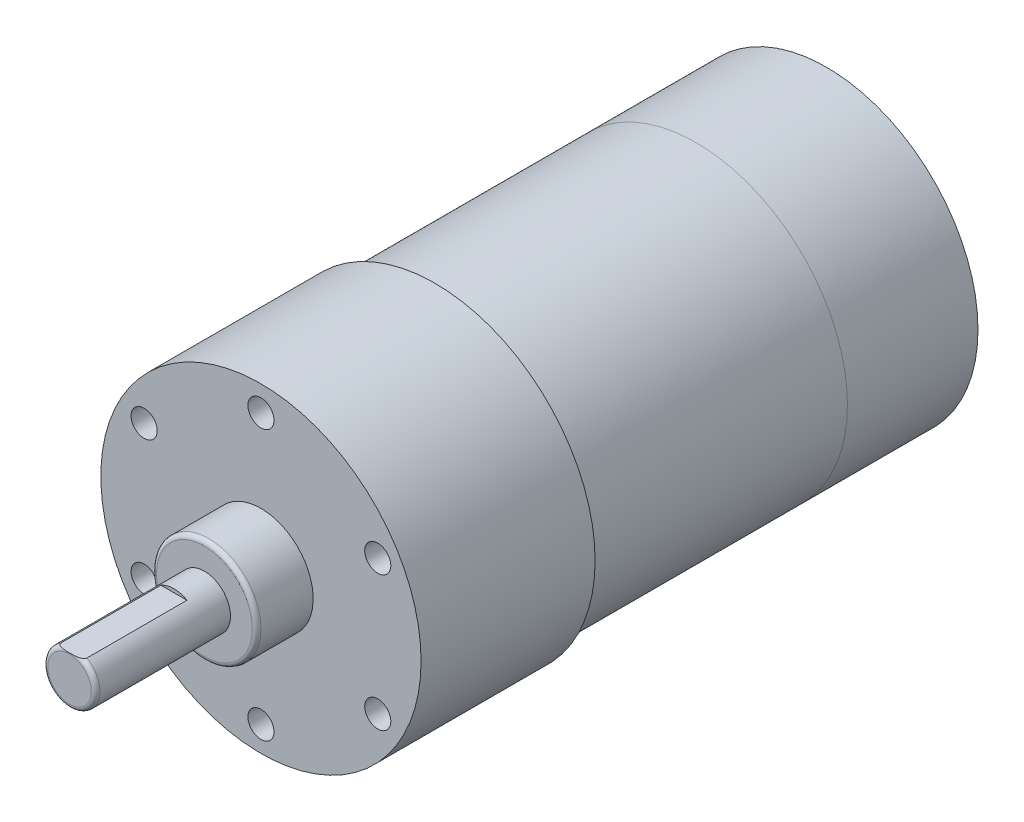
ISO-10303-21;
HEADER;
FILE_DESCRIPTION(('STEP AP214'),'2;1');
FILE_NAME('part.step','',(''),(''),'','','');
FILE_SCHEMA(('AUTOMOTIVE_DESIGN { 1 0 10303 214 1 1 1 1 }'));
ENDSEC;
DATA;
#1=APPLICATION_CONTEXT('core data for automotive mechanical design processes');
#2=APPLICATION_PROTOCOL_DEFINITION('international standard','automotive_design',2000,#1);
#3=PRODUCT_CONTEXT('',#1,'mechanical');
#4=PRODUCT('Part','Part','',(#3));
#5=PRODUCT_RELATED_PRODUCT_CATEGORY('part','',(#4));
#6=PRODUCT_DEFINITION_FORMATION('','',#4);
#7=PRODUCT_DEFINITION_CONTEXT('part definition',#1,'design');
#8=PRODUCT_DEFINITION('design','',#6,#7);
#9=PRODUCT_DEFINITION_SHAPE('','',#8);
#10=(LENGTH_UNIT() NAMED_UNIT(*) SI_UNIT(.MILLI.,.METRE.));
#11=(NAMED_UNIT(*) PLANE_ANGLE_UNIT() SI_UNIT($,.RADIAN.));
#12=(NAMED_UNIT(*) SI_UNIT($,.STERADIAN.) SOLID_ANGLE_UNIT());
#13=UNCERTAINTY_MEASURE_WITH_UNIT(LENGTH_MEASURE(1.E-05),#10,'distance_accuracy_value','');
#14=(GEOMETRIC_REPRESENTATION_CONTEXT(3) GLOBAL_UNCERTAINTY_ASSIGNED_CONTEXT((#13)) GLOBAL_UNIT_ASSIGNED_CONTEXT((#10,
#11,#12)) REPRESENTATION_CONTEXT('',''));
#15=CARTESIAN_POINT('',(0.,0.,0.));
#16=DIRECTION('',(0.,0.,1.));
#17=DIRECTION('',(1.,0.,0.));
#18=AXIS2_PLACEMENT_3D('',#15,#16,#17);
#19=CARTESIAN_POINT('',(0.,0.,-45.));
#20=DIRECTION('',(0.,0.,1.));
#21=DIRECTION('',(1.,0.,0.));
#22=AXIS2_PLACEMENT_3D('',#19,#20,#21);
#23=CYLINDRICAL_SURFACE('',#22,17.4);
#24=CARTESIAN_POINT('',(0.,0.,-45.));
#25=DIRECTION('',(0.,0.,-1.));
#26=DIRECTION('',(-1.,0.,0.));
#27=AXIS2_PLACEMENT_3D('',#24,#25,#26);
#28=CIRCLE('',#27,17.4);
#29=CARTESIAN_POINT('',(-17.4,0.,-45.));
#30=VERTEX_POINT('',#29);
#31=EDGE_CURVE('E11',#30,#30,#28,.T.);
#32=ORIENTED_EDGE('',*,*,#31,.F.);
#33=EDGE_LOOP('',(#32));
#34=FACE_BOUND('',#33,.T.);
#35=CARTESIAN_POINT('',(0.,0.,-30.));
#36=DIRECTION('',(0.,0.,-1.));
#37=DIRECTION('',(-1.,0.,0.));
#38=AXIS2_PLACEMENT_3D('',#35,#36,#37);
#39=CIRCLE('',#38,17.4);
#40=CARTESIAN_POINT('',(-17.4,0.,-30.));
#41=VERTEX_POINT('',#40);
#42=EDGE_CURVE('E46',#41,#41,#39,.T.);
#43=ORIENTED_EDGE('',*,*,#42,.T.);
#44=EDGE_LOOP('',(#43));
#45=FACE_BOUND('',#44,.T.);
#46=ADVANCED_FACE('F43',(#34,#45),#23,.T.);
#47=CARTESIAN_POINT('',(0.,0.,-45.));
#48=DIRECTION('',(0.,0.,-1.));
#49=DIRECTION('',(-1.,0.,0.));
#50=AXIS2_PLACEMENT_3D('',#47,#48,#49);
#51=PLANE('',#50);
#52=ORIENTED_EDGE('',*,*,#31,.T.);
#53=EDGE_LOOP('',(#52));
#54=FACE_BOUND('',#53,.T.);
#55=ADVANCED_FACE('F58',(#54),#51,.T.);
#56=CARTESIAN_POINT('',(0.,0.,-30.));
#57=DIRECTION('',(0.,0.,-1.));
#58=DIRECTION('',(-1.,0.,0.));
#59=AXIS2_PLACEMENT_3D('',#56,#57,#58);
#60=PLANE('',#59);
#61=ORIENTED_EDGE('',*,*,#42,.F.);
#62=EDGE_LOOP('',(#61));
#63=FACE_BOUND('',#62,.T.);
#64=ADVANCED_FACE('F56',(#63),#60,.F.);
#65=CLOSED_SHELL('',(#46,#55,#64));
#66=MANIFOLD_SOLID_BREP('B2',#65);
#67=CARTESIAN_POINT('',(0.,0.,26.5));
#68=DIRECTION('',(0.,0.,1.));
#69=DIRECTION('',(1.,0.,0.));
#70=AXIS2_PLACEMENT_3D('',#67,#68,#69);
#71=PLANE('',#70);
#72=CARTESIAN_POINT('',(0.,0.,26.5));
#73=DIRECTION('',(0.,0.,1.));
#74=DIRECTION('',(1.,0.,0.));
#75=AXIS2_PLACEMENT_3D('',#72,#73,#74);
#76=CIRCLE('',#75,5.5);
#77=CARTESIAN_POINT('',(5.5,0.,26.5));
#78=VERTEX_POINT('',#77);
#79=EDGE_CURVE('E207',#78,#78,#76,.T.);
#80=ORIENTED_EDGE('',*,*,#79,.T.);
#81=EDGE_LOOP('',(#80));
#82=FACE_BOUND('',#81,.T.);
#83=CARTESIAN_POINT('',(0.,0.,26.5));
#84=DIRECTION('',(0.,0.,1.));
#85=DIRECTION('',(1.,0.,0.));
#86=AXIS2_PLACEMENT_3D('',#83,#84,#85);
#87=CIRCLE('',#86,3.);
#88=CARTESIAN_POINT('',(3.,0.,26.5));
#89=VERTEX_POINT('',#88);
#90=EDGE_CURVE('E188',#89,#89,#87,.T.);
#91=ORIENTED_EDGE('',*,*,#90,.F.);
#92=EDGE_LOOP('',(#91));
#93=FACE_BOUND('',#92,.T.);
#94=ADVANCED_FACE('F84',(#82,#93),#71,.T.);
#95=CARTESIAN_POINT('',(0.,0.,20.));
#96=DIRECTION('',(0.,0.,1.));
#97=DIRECTION('',(1.,0.,0.));
#98=AXIS2_PLACEMENT_3D('',#95,#96,#97);
#99=PLANE('',#98);
#100=CARTESIAN_POINT('',(-13.4233937586588,7.75,20.));
#101=DIRECTION('',(0.,0.,1.));
#102=DIRECTION('',(1.,0.,0.));
#103=AXIS2_PLACEMENT_3D('',#100,#101,#102);
#104=CIRCLE('',#103,1.5);
#105=CARTESIAN_POINT('',(-11.9233937586588,7.75,20.));
#106=VERTEX_POINT('',#105);
#107=EDGE_CURVE('E146',#106,#106,#104,.T.);
#108=ORIENTED_EDGE('',*,*,#107,.F.);
#109=EDGE_LOOP('',(#108));
#110=FACE_BOUND('',#109,.T.);
#111=CARTESIAN_POINT('',(-13.4233937586588,-7.75,20.));
#112=DIRECTION('',(0.,0.,1.));
#113=DIRECTION('',(1.,0.,0.));
#114=AXIS2_PLACEMENT_3D('',#111,#112,#113);
#115=CIRCLE('',#114,1.5);
#116=CARTESIAN_POINT('',(-11.9233937586588,-7.75,20.));
#117=VERTEX_POINT('',#116);
#118=EDGE_CURVE('E145',#117,#117,#115,.T.);
#119=ORIENTED_EDGE('',*,*,#118,.F.);
#120=EDGE_LOOP('',(#119));
#121=FACE_BOUND('',#120,.T.);
#122=CARTESIAN_POINT('',(0.,-15.5,20.));
#123=DIRECTION('',(0.,0.,1.));
#124=DIRECTION('',(1.,0.,0.));
#125=AXIS2_PLACEMENT_3D('',#122,#123,#124);
#126=CIRCLE('',#125,1.5);
#127=CARTESIAN_POINT('',(1.5,-15.5,20.));
#128=VERTEX_POINT('',#127);
#129=EDGE_CURVE('E156',#128,#128,#126,.T.);
#130=ORIENTED_EDGE('',*,*,#129,.F.);
#131=EDGE_LOOP('',(#130));
#132=FACE_BOUND('',#131,.T.);
#133=CARTESIAN_POINT('',(13.4233937586588,7.75,20.));
#134=DIRECTION('',(0.,0.,1.));
#135=DIRECTION('',(1.,0.,0.));
#136=AXIS2_PLACEMENT_3D('',#133,#134,#135);
#137=CIRCLE('',#136,1.5);
#138=CARTESIAN_POINT('',(14.9233937586588,7.75,20.));
#139=VERTEX_POINT('',#138);
#140=EDGE_CURVE('E162',#139,#139,#137,.T.);
#141=ORIENTED_EDGE('',*,*,#140,.F.);
#142=EDGE_LOOP('',(#141));
#143=FACE_BOUND('',#142,.T.);
#144=CARTESIAN_POINT('',(0.,15.5,20.));
#145=DIRECTION('',(0.,0.,1.));
#146=DIRECTION('',(1.,0.,0.));
#147=AXIS2_PLACEMENT_3D('',#144,#145,#146);
#148=CIRCLE('',#147,1.5);
#149=CARTESIAN_POINT('',(1.5,15.5,20.));
#150=VERTEX_POINT('',#149);
#151=EDGE_CURVE('E168',#150,#150,#148,.T.);
#152=ORIENTED_EDGE('',*,*,#151,.F.);
#153=EDGE_LOOP('',(#152));
#154=FACE_BOUND('',#153,.T.);
#155=CARTESIAN_POINT('',(13.4233937586588,-7.75,20.));
#156=DIRECTION('',(0.,0.,1.));
#157=DIRECTION('',(1.,0.,0.));
#158=AXIS2_PLACEMENT_3D('',#155,#156,#157);
#159=CIRCLE('',#158,1.5);
#160=CARTESIAN_POINT('',(14.9233937586588,-7.75,20.));
#161=VERTEX_POINT('',#160);
#162=EDGE_CURVE('E174',#161,#161,#159,.T.);
#163=ORIENTED_EDGE('',*,*,#162,.F.);
#164=EDGE_LOOP('',(#163));
#165=FACE_BOUND('',#164,.T.);
#166=CARTESIAN_POINT('',(0.,0.,20.));
#167=DIRECTION('',(0.,0.,1.));
#168=DIRECTION('',(1.,0.,0.));
#169=AXIS2_PLACEMENT_3D('',#166,#167,#168);
#170=CIRCLE('',#169,18.4);
#171=CARTESIAN_POINT('',(18.4,0.,20.));
#172=VERTEX_POINT('',#171);
#173=EDGE_CURVE('E199',#172,#172,#170,.T.);
#174=ORIENTED_EDGE('',*,*,#173,.T.);
#175=EDGE_LOOP('',(#174));
#176=FACE_BOUND('',#175,.T.);
#177=CARTESIAN_POINT('',(0.,0.,20.));
#178=DIRECTION('',(0.,0.,1.));
#179=DIRECTION('',(1.,0.,0.));
#180=AXIS2_PLACEMENT_3D('',#177,#178,#179);
#181=CIRCLE('',#180,6.);
#182=CARTESIAN_POINT('',(-6.,0.,20.));
#183=VERTEX_POINT('',#182);
#184=EDGE_CURVE('E192',#183,#183,#181,.T.);
#185=ORIENTED_EDGE('',*,*,#184,.F.);
#186=EDGE_LOOP('',(#185));
#187=FACE_BOUND('',#186,.T.);
#188=ADVANCED_FACE('F237',(#110,#121,#132,#143,#154,#165,#176,#187),#99,.T.);
#189=CARTESIAN_POINT('',(0.,0.,0.));
#190=DIRECTION('',(0.,0.,1.));
#191=DIRECTION('',(1.,0.,0.));
#192=AXIS2_PLACEMENT_3D('',#189,#190,#191);
#193=PLANE('',#192);
#194=CARTESIAN_POINT('',(0.,0.,0.));
#195=DIRECTION('',(0.,0.,1.));
#196=DIRECTION('',(1.,0.,0.));
#197=AXIS2_PLACEMENT_3D('',#194,#195,#196);
#198=CIRCLE('',#197,18.4);
#199=CARTESIAN_POINT('',(18.4,0.,0.));
#200=VERTEX_POINT('',#199);
#201=EDGE_CURVE('E198',#200,#200,#198,.T.);
#202=ORIENTED_EDGE('',*,*,#201,.F.);
#203=EDGE_LOOP('',(#202));
#204=FACE_BOUND('',#203,.T.);
#205=CARTESIAN_POINT('',(0.,0.,0.));
#206=DIRECTION('',(0.,0.,1.));
#207=DIRECTION('',(1.,0.,0.));
#208=AXIS2_PLACEMENT_3D('',#205,#206,#207);
#209=CIRCLE('',#208,17.4);
#210=CARTESIAN_POINT('',(17.4,0.,0.));
#211=VERTEX_POINT('',#210);
#212=EDGE_CURVE('E202',#211,#211,#209,.F.);
#213=ORIENTED_EDGE('',*,*,#212,.F.);
#214=EDGE_LOOP('',(#213));
#215=FACE_BOUND('',#214,.T.);
#216=ADVANCED_FACE('F243',(#204,#215),#193,.F.);
#217=CARTESIAN_POINT('',(0.,0.,20.));
#218=DIRECTION('',(0.,0.,-1.));
#219=DIRECTION('',(-1.,0.,0.));
#220=AXIS2_PLACEMENT_3D('',#217,#218,#219);
#221=CYLINDRICAL_SURFACE('',#220,18.4);
#222=ORIENTED_EDGE('',*,*,#173,.F.);
#223=EDGE_LOOP('',(#222));
#224=FACE_BOUND('',#223,.T.);
#225=ORIENTED_EDGE('',*,*,#201,.T.);
#226=EDGE_LOOP('',(#225));
#227=FACE_BOUND('',#226,.T.);
#228=ADVANCED_FACE('F261',(#224,#227),#221,.T.);
#229=CARTESIAN_POINT('',(0.,0.,-30.));
#230=DIRECTION('',(0.,0.,1.));
#231=DIRECTION('',(1.,0.,0.));
#232=AXIS2_PLACEMENT_3D('',#229,#230,#231);
#233=CYLINDRICAL_SURFACE('',#232,17.4);
#234=CARTESIAN_POINT('',(0.,0.,-30.));
#235=DIRECTION('',(0.,0.,-1.));
#236=DIRECTION('',(-1.,0.,0.));
#237=AXIS2_PLACEMENT_3D('',#234,#235,#236);
#238=CIRCLE('',#237,17.4);
#239=CARTESIAN_POINT('',(-17.4,0.,-30.));
#240=VERTEX_POINT('',#239);
#241=EDGE_CURVE('E195',#240,#240,#238,.T.);
#242=ORIENTED_EDGE('',*,*,#241,.F.);
#243=EDGE_LOOP('',(#242));
#244=FACE_BOUND('',#243,.T.);
#245=ORIENTED_EDGE('',*,*,#212,.T.);
#246=EDGE_LOOP('',(#245));
#247=FACE_BOUND('',#246,.T.);
#248=ADVANCED_FACE('F258',(#244,#247),#233,.T.);
#249=CARTESIAN_POINT('',(0.,0.,-30.));
#250=DIRECTION('',(0.,0.,-1.));
#251=DIRECTION('',(-1.,0.,0.));
#252=AXIS2_PLACEMENT_3D('',#249,#250,#251);
#253=PLANE('',#252);
#254=ORIENTED_EDGE('',*,*,#241,.T.);
#255=EDGE_LOOP('',(#254));
#256=FACE_BOUND('',#255,.T.);
#257=ADVANCED_FACE('F254',(#256),#253,.T.);
#258=CARTESIAN_POINT('',(0.,0.,26.5));
#259=DIRECTION('',(0.,0.,-1.));
#260=DIRECTION('',(-1.,0.,0.));
#261=AXIS2_PLACEMENT_3D('',#258,#259,#260);
#262=CYLINDRICAL_SURFACE('',#261,6.);
#263=CARTESIAN_POINT('',(0.,0.,26.));
#264=DIRECTION('',(0.,0.,1.));
#265=DIRECTION('',(1.,0.,0.));
#266=AXIS2_PLACEMENT_3D('',#263,#264,#265);
#267=CIRCLE('',#266,6.);
#268=CARTESIAN_POINT('',(-6.,0.,26.));
#269=VERTEX_POINT('',#268);
#270=EDGE_CURVE('E210',#269,#269,#267,.F.);
#271=CARTESIAN_POINT('',(-6.,0.,26.));
#272=CARTESIAN_POINT('',(-6.,0.,25.9375));
#273=CARTESIAN_POINT('',(-6.,0.,25.875));
#274=CARTESIAN_POINT('',(-6.,0.,25.75));
#275=CARTESIAN_POINT('',(-6.,0.,25.6875));
#276=CARTESIAN_POINT('',(-6.,0.,25.5625));
#277=CARTESIAN_POINT('',(-6.,0.,25.5));
#278=CARTESIAN_POINT('',(-6.,0.,25.375));
#279=CARTESIAN_POINT('',(-6.,0.,25.3125));
#280=CARTESIAN_POINT('',(-6.,0.,25.1875));
#281=CARTESIAN_POINT('',(-6.,0.,25.125));
#282=CARTESIAN_POINT('',(-6.,0.,25.));
#283=CARTESIAN_POINT('',(-6.,0.,24.9375));
#284=CARTESIAN_POINT('',(-6.,0.,24.8125));
#285=CARTESIAN_POINT('',(-6.,0.,24.75));
#286=CARTESIAN_POINT('',(-6.,0.,24.625));
#287=CARTESIAN_POINT('',(-6.,0.,24.5625));
#288=CARTESIAN_POINT('',(-6.,0.,24.4375));
#289=CARTESIAN_POINT('',(-6.,0.,24.375));
#290=CARTESIAN_POINT('',(-6.,0.,24.25));
#291=CARTESIAN_POINT('',(-6.,0.,24.1875));
#292=CARTESIAN_POINT('',(-6.,0.,24.0625));
#293=CARTESIAN_POINT('',(-6.,0.,24.));
#294=CARTESIAN_POINT('',(-6.,0.,23.875));
#295=CARTESIAN_POINT('',(-6.,0.,23.8125));
#296=CARTESIAN_POINT('',(-6.,0.,23.6875));
#297=CARTESIAN_POINT('',(-6.,0.,23.625));
#298=CARTESIAN_POINT('',(-6.,0.,23.5));
#299=CARTESIAN_POINT('',(-6.,0.,23.4375));
#300=CARTESIAN_POINT('',(-6.,0.,23.3125));
#301=CARTESIAN_POINT('',(-6.,0.,23.25));
#302=CARTESIAN_POINT('',(-6.,0.,23.125));
#303=CARTESIAN_POINT('',(-6.,0.,23.0625));
#304=CARTESIAN_POINT('',(-6.,0.,22.9375));
#305=CARTESIAN_POINT('',(-6.,0.,22.875));
#306=CARTESIAN_POINT('',(-6.,0.,22.75));
#307=CARTESIAN_POINT('',(-6.,0.,22.6875));
#308=CARTESIAN_POINT('',(-6.,0.,22.5625));
#309=CARTESIAN_POINT('',(-6.,0.,22.5));
#310=CARTESIAN_POINT('',(-6.,0.,22.375));
#311=CARTESIAN_POINT('',(-6.,0.,22.3125));
#312=CARTESIAN_POINT('',(-6.,0.,22.1875));
#313=CARTESIAN_POINT('',(-6.,0.,22.125));
#314=CARTESIAN_POINT('',(-6.,0.,22.));
#315=CARTESIAN_POINT('',(-6.,0.,21.9375));
#316=CARTESIAN_POINT('',(-6.,0.,21.8125));
#317=CARTESIAN_POINT('',(-6.,0.,21.75));
#318=CARTESIAN_POINT('',(-6.,0.,21.625));
#319=CARTESIAN_POINT('',(-6.,0.,21.5625));
#320=CARTESIAN_POINT('',(-6.,0.,21.4375));
#321=CARTESIAN_POINT('',(-6.,0.,21.375));
#322=CARTESIAN_POINT('',(-6.,0.,21.25));
#323=CARTESIAN_POINT('',(-6.,0.,21.1875));
#324=CARTESIAN_POINT('',(-6.,0.,21.0625));
#325=CARTESIAN_POINT('',(-6.,0.,21.));
#326=CARTESIAN_POINT('',(-6.,0.,20.875));
#327=CARTESIAN_POINT('',(-6.,0.,20.8125));
#328=CARTESIAN_POINT('',(-6.,0.,20.6875));
#329=CARTESIAN_POINT('',(-6.,0.,20.625));
#330=CARTESIAN_POINT('',(-6.,0.,20.5));
#331=CARTESIAN_POINT('',(-6.,0.,20.4375));
#332=CARTESIAN_POINT('',(-6.,0.,20.3125));
#333=CARTESIAN_POINT('',(-6.,0.,20.25));
#334=CARTESIAN_POINT('',(-6.,0.,20.125));
#335=CARTESIAN_POINT('',(-6.,0.,20.0625));
#336=CARTESIAN_POINT('',(-6.,0.,20.));
#337=B_SPLINE_CURVE_WITH_KNOTS('',3,(#271,#272,#273,#274,#275,#276,#277,#278,#279,#280,#281,
#282,#283,#284,#285,#286,#287,#288,#289,#290,#291,#292,#293,#294,#295,#296,#297,#298,#299,#300,
#301,#302,#303,#304,#305,#306,#307,#308,#309,#310,#311,#312,#313,#314,#315,#316,#317,#318,#319,
#320,#321,#322,#323,#324,#325,#326,#327,#328,#329,#330,#331,#332,#333,#334,#335,#336),
.UNSPECIFIED.,.F.,.F.,(4,2,2,2,2,2,2,2,2,2,2,2,2,2,2,2,2,2,2,2,2,2,2,2,2,2,2,2,2,2,2,2,4),(0.,
0.1875,0.375,0.5625,0.750000000000001,0.937500000000001,1.125,1.3125,1.5,1.6875,1.875,2.0625,
2.25,2.4375,2.625,2.8125,3.,3.1875,3.375,3.5625,3.75,3.9375,4.125,4.3125,4.5,4.6875,4.875,
5.0625,5.25,5.4375,5.625,5.8125,6.),.UNSPECIFIED.);
#338=EDGE_CURVE('BSEAM250',#269,#183,#337,.T.);
#339=ORIENTED_EDGE('',*,*,#270,.T.);
#340=ORIENTED_EDGE('',*,*,#184,.T.);
#341=ORIENTED_EDGE('',*,*,#338,.T.);
#342=ORIENTED_EDGE('',*,*,#338,.F.);
#343=EDGE_LOOP('',(#339,#341,#340,#342));
#344=FACE_BOUND('',#343,.T.);
#345=ADVANCED_FACE('F250',(#344),#262,.T.);
#346=CARTESIAN_POINT('',(0.,0.,26.));
#347=DIRECTION('',(0.,0.,1.));
#348=DIRECTION('',(1.,0.,0.));
#349=AXIS2_PLACEMENT_3D('',#346,#347,#348);
#350=TOROIDAL_SURFACE('',#349,5.5,0.5);
#351=ORIENTED_EDGE('',*,*,#270,.F.);
#352=EDGE_LOOP('',(#351));
#353=FACE_BOUND('',#352,.T.);
#354=ORIENTED_EDGE('',*,*,#79,.F.);
#355=EDGE_LOOP('',(#354));
#356=FACE_BOUND('',#355,.T.);
#357=ADVANCED_FACE('F253',(#353,#356),#350,.T.);
#358=CARTESIAN_POINT('',(0.,0.,42.));
#359=DIRECTION('',(0.,0.,-1.));
#360=DIRECTION('',(-1.,0.,0.));
#361=AXIS2_PLACEMENT_3D('',#358,#359,#360);
#362=CYLINDRICAL_SURFACE('',#361,3.);
#363=DIRECTION('',(0.,0.,1.));
#364=VECTOR('',#363,1.);
#365=CARTESIAN_POINT('',(1.49666295470958,2.6,30.));
#366=LINE('',#365,#364);
#367=CARTESIAN_POINT('',(1.49666295470958,2.6,30.));
#368=VERTEX_POINT('',#367);
#369=CARTESIAN_POINT('',(1.49666295470958,2.6,41.4999999999998));
#370=VERTEX_POINT('',#369);
#371=EDGE_CURVE('E186',#368,#370,#366,.T.);
#372=ORIENTED_EDGE('',*,*,#371,.T.);
#373=CARTESIAN_POINT('',(0.,0.,41.5));
#374=DIRECTION('',(0.,0.,1.));
#375=DIRECTION('',(1.,0.,0.));
#376=AXIS2_PLACEMENT_3D('',#373,#374,#375);
#377=CIRCLE('',#376,3.);
#378=CARTESIAN_POINT('',(-1.49666295470958,2.6,41.5));
#379=VERTEX_POINT('',#378);
#380=EDGE_CURVE('E98',#370,#379,#377,.F.);
#381=ORIENTED_EDGE('',*,*,#380,.T.);
#382=DIRECTION('',(0.,0.,1.));
#383=VECTOR('',#382,1.);
#384=CARTESIAN_POINT('',(-1.49666295470958,2.6,30.));
#385=LINE('',#384,#383);
#386=CARTESIAN_POINT('',(-1.49666295470958,2.6,30.));
#387=VERTEX_POINT('',#386);
#388=EDGE_CURVE('E185',#387,#379,#385,.T.);
#389=ORIENTED_EDGE('',*,*,#388,.F.);
#390=CARTESIAN_POINT('',(0.,0.,30.));
#391=DIRECTION('',(0.,0.,1.));
#392=DIRECTION('',(1.,0.,0.));
#393=AXIS2_PLACEMENT_3D('',#390,#391,#392);
#394=CIRCLE('',#393,3.);
#395=EDGE_CURVE('E180',#368,#387,#394,.T.);
#396=ORIENTED_EDGE('',*,*,#395,.F.);
#397=EDGE_LOOP('',(#372,#381,#389,#396));
#398=FACE_BOUND('',#397,.T.);
#399=ORIENTED_EDGE('',*,*,#90,.T.);
#400=EDGE_LOOP('',(#399));
#401=FACE_BOUND('',#400,.T.);
#402=ADVANCED_FACE('F217',(#398,#401),#362,.T.);
#403=CARTESIAN_POINT('',(0.,0.,42.));
#404=DIRECTION('',(0.,0.,1.));
#405=DIRECTION('',(1.,0.,0.));
#406=AXIS2_PLACEMENT_3D('',#403,#404,#405);
#407=PLANE('',#406);
#408=CARTESIAN_POINT('',(0.,0.,42.));
#409=DIRECTION('',(0.,0.,1.));
#410=DIRECTION('',(1.,0.,0.));
#411=AXIS2_PLACEMENT_3D('',#408,#409,#410);
#412=CIRCLE('',#411,2.5);
#413=CARTESIAN_POINT('',(-1.24721912892465,2.16666666666667,42.));
#414=VERTEX_POINT('',#413);
#415=EDGE_CURVE('E103',#414,#414,#412,.T.);
#416=ORIENTED_EDGE('',*,*,#415,.T.);
#417=EDGE_LOOP('',(#416));
#418=FACE_BOUND('',#417,.T.);
#419=ADVANCED_FACE('F235',(#418),#407,.T.);
#420=CARTESIAN_POINT('',(-1.49666295470958,2.6,30.));
#421=DIRECTION('',(0.,-1.,0.));
#422=DIRECTION('',(0.,0.,-1.));
#423=AXIS2_PLACEMENT_3D('',#420,#421,#422);
#424=PLANE('',#423);
#425=ORIENTED_EDGE('',*,*,#388,.T.);
#426=CARTESIAN_POINT('',(-1.49666295470958,2.6,41.5));
#427=CARTESIAN_POINT('',(-1.49669702817725,2.6,41.5149051021484));
#428=CARTESIAN_POINT('',(-1.49532916324475,2.6,41.529774095933));
#429=CARTESIAN_POINT('',(-1.49008555059725,2.6,41.5589406315826));
#430=CARTESIAN_POINT('',(-1.48623084270994,2.6,41.5732419088318));
#431=CARTESIAN_POINT('',(-1.47631424041933,2.6,41.6009976942714));
#432=CARTESIAN_POINT('',(-1.47025833364427,2.6,41.6144543845247));
#433=CARTESIAN_POINT('',(-1.45631551957669,2.6,41.6404029162101));
#434=CARTESIAN_POINT('',(-1.44842462542037,2.6,41.6528925766694));
#435=CARTESIAN_POINT('',(-1.42570518024786,2.6,41.6844102631289));
#436=CARTESIAN_POINT('',(-1.40965256605042,2.6,41.7025553894644));
#437=CARTESIAN_POINT('',(-1.37493497617681,2.6,41.73613599544));
#438=CARTESIAN_POINT('',(-1.35626302749216,2.6,41.7515639860004));
#439=CARTESIAN_POINT('',(-1.303311046172,2.6,41.7901504925236));
#440=CARTESIAN_POINT('',(-1.2673704467773,2.6,41.8110092009974));
#441=CARTESIAN_POINT('',(-1.19295719544131,2.6,41.847388756016));
#442=CARTESIAN_POINT('',(-1.15447968566197,2.6,41.8628989852143));
#443=CARTESIAN_POINT('',(-1.05901836077041,2.6,41.8958138881155));
#444=CARTESIAN_POINT('',(-1.00130953423696,2.6,41.911073498837));
#445=CARTESIAN_POINT('',(-0.884661853079624,2.6,41.9360190476372));
#446=CARTESIAN_POINT('',(-0.825720319679469,2.6,41.9456911693697));
#447=CARTESIAN_POINT('',(-0.706961867611124,2.6,41.9612892459589));
#448=CARTESIAN_POINT('',(-0.647141725368451,2.6,41.9671894614307));
#449=CARTESIAN_POINT('',(-0.527387957226671,2.6,41.9764426430905));
#450=CARTESIAN_POINT('',(-0.467454524720628,2.6,41.9797983644472));
#451=CARTESIAN_POINT('',(-0.360303639693319,2.6,41.9843271761355));
#452=CARTESIAN_POINT('',(-0.313098201426873,2.6,41.9858130032282));
#453=CARTESIAN_POINT('',(-0.218669247129662,2.6,41.9880539304078));
#454=CARTESIAN_POINT('',(-0.171445730569167,2.6,41.9888090071301));
#455=CARTESIAN_POINT('',(-0.0769568934924944,2.6,41.9897577844721));
#456=CARTESIAN_POINT('',(-0.0296915690013754,2.6,41.9899510485086));
#457=CARTESIAN_POINT('',(0.0648383568274983,2.6,41.9898205958692));
#458=CARTESIAN_POINT('',(0.112102958166579,2.6,41.989496880295));
#459=CARTESIAN_POINT('',(0.206489004396231,2.6,41.9882580510872));
#460=CARTESIAN_POINT('',(0.253610470119574,2.6,41.9873446407243));
#461=CARTESIAN_POINT('',(0.347830700528196,2.6,41.9847313431131));
#462=CARTESIAN_POINT('',(0.394929466241519,2.6,41.9830314956638));
#463=CARTESIAN_POINT('',(0.489032205532437,2.6,41.9785275098704));
#464=CARTESIAN_POINT('',(0.536036226633943,2.6,41.9757244177043));
#465=CARTESIAN_POINT('',(0.629922549059666,2.6,41.9685656531621));
#466=CARTESIAN_POINT('',(0.676804874337732,2.6,41.9642103140601));
#467=CARTESIAN_POINT('',(0.76359650866924,2.6,41.9541263142836));
#468=CARTESIAN_POINT('',(0.803538333446084,2.6,41.9486855014514));
#469=CARTESIAN_POINT('',(0.883122010625979,2.6,41.9357295010266));
#470=CARTESIAN_POINT('',(0.922763646083339,2.6,41.9282129375471));
#471=CARTESIAN_POINT('',(1.00139823900068,2.6,41.910494115249));
#472=CARTESIAN_POINT('',(1.04039205130276,2.6,41.9002957543494));
#473=CARTESIAN_POINT('',(1.11727064150479,2.6,41.8763996298495));
#474=CARTESIAN_POINT('',(1.1551569510228,2.6,41.8627069813272));
#475=CARTESIAN_POINT('',(1.22944813861561,2.6,41.8305463184295));
#476=CARTESIAN_POINT('',(1.26582905492489,2.6,41.8120216232796));
#477=CARTESIAN_POINT('',(1.33470227153027,2.6,41.7688231560639));
#478=CARTESIAN_POINT('',(1.36722000464244,2.6,41.744193326085));
#479=CARTESIAN_POINT('',(1.40822324657555,2.6,41.7036284868606));
#480=CARTESIAN_POINT('',(1.41978987048696,2.6,41.690816953772));
#481=CARTESIAN_POINT('',(1.44109681949932,2.6,41.6637313181759));
#482=CARTESIAN_POINT('',(1.45083729481483,2.6,41.6494573361155));
#483=CARTESIAN_POINT('',(1.46801249183189,2.6,41.6193494890491));
#484=CARTESIAN_POINT('',(1.47542073208243,2.6,41.6035002223719));
#485=CARTESIAN_POINT('',(1.48713863782566,2.6,41.5706994380282));
#486=CARTESIAN_POINT('',(1.49145442932523,2.6,41.553750172498));
#487=CARTESIAN_POINT('',(1.49627778271818,2.6,41.5208985771865));
#488=CARTESIAN_POINT('',(1.49709738041115,2.6,41.5050421628976));
#489=CARTESIAN_POINT('',(1.49575949781529,2.6,41.473323459888));
#490=CARTESIAN_POINT('',(1.49357704682929,2.6,41.4574622324275));
#491=CARTESIAN_POINT('',(1.48987446930463,2.6,41.4419527308315));
#492=B_SPLINE_CURVE_WITH_KNOTS('',3,(#426,#427,#428,#429,#430,#431,#432,#433,#434,#435,#436,
#437,#438,#439,#440,#441,#442,#443,#444,#445,#446,#447,#448,#449,#450,#451,#452,#453,#454,#455,
#456,#457,#458,#459,#460,#461,#462,#463,#464,#465,#466,#467,#468,#469,#470,#471,#472,#473,#474,
#475,#476,#477,#478,#479,#480,#481,#482,#483,#484,#485,#486,#487,#488,#489,#490,#491),
.UNSPECIFIED.,.F.,.F.,(4,2,2,2,2,2,2,2,2,2,2,2,2,2,2,2,2,2,2,2,2,2,2,2,2,2,2,2,2,2,2,2,4),(0.,
0.044595272164786,0.0888181097439601,0.132921543203815,0.177121710256437,0.249382432511188,
0.321839307557631,0.44579791119591,0.57000118916151,0.748597910004915,0.927634382412785,
1.1078799085406,1.28792998569448,1.42960976431829,1.57129407275093,1.71308845429779,
1.85488253373345,1.99626887743125,2.13764806682503,2.27889351181035,2.42010864904588,
2.54100078056763,2.66197323714651,2.78277082621242,2.90339259122099,3.02549842069348,
3.14674968392238,3.19840665202863,3.25005936909162,3.30227902718043,3.354394952239,
3.40174717858884,3.44949566606297),.UNSPECIFIED.);
#493=EDGE_CURVE('E41',#379,#370,#492,.T.);
#494=ORIENTED_EDGE('',*,*,#493,.T.);
#495=ORIENTED_EDGE('',*,*,#371,.F.);
#496=DIRECTION('',(1.,0.,0.));
#497=VECTOR('',#496,1.);
#498=CARTESIAN_POINT('',(-1.49666295470958,2.6,30.));
#499=LINE('',#498,#497);
#500=EDGE_CURVE('E182',#387,#368,#499,.T.);
#501=ORIENTED_EDGE('',*,*,#500,.F.);
#502=EDGE_LOOP('',(#425,#494,#495,#501));
#503=FACE_BOUND('',#502,.T.);
#504=ADVANCED_FACE('F222',(#503),#424,.F.);
#505=CARTESIAN_POINT('',(0.,0.,30.));
#506=DIRECTION('',(0.,0.,1.));
#507=DIRECTION('',(1.,0.,0.));
#508=AXIS2_PLACEMENT_3D('',#505,#506,#507);
#509=PLANE('',#508);
#510=ORIENTED_EDGE('',*,*,#395,.T.);
#511=ORIENTED_EDGE('',*,*,#500,.T.);
#512=EDGE_LOOP('',(#510,#511));
#513=FACE_BOUND('',#512,.T.);
#514=ADVANCED_FACE('F224',(#513),#509,.T.);
#515=CARTESIAN_POINT('',(13.4233937586588,-7.75,17.));
#516=DIRECTION('',(0.,0.,1.));
#517=DIRECTION('',(1.,0.,0.));
#518=AXIS2_PLACEMENT_3D('',#515,#516,#517);
#519=CONICAL_SURFACE('',#518,1.5,1.02974425867665);
#520=CARTESIAN_POINT('',(13.4233937586588,-7.75,16.0987090714587));
#521=VERTEX_POINT('',#520);
#522=VERTEX_LOOP('',#521);
#523=FACE_BOUND('',#522,.T.);
#524=CARTESIAN_POINT('',(13.4233937586588,-7.75,17.));
#525=DIRECTION('',(0.,0.,1.));
#526=DIRECTION('',(1.,0.,0.));
#527=AXIS2_PLACEMENT_3D('',#524,#525,#526);
#528=CIRCLE('',#527,1.5);
#529=CARTESIAN_POINT('',(14.9233937586588,-7.75,17.));
#530=VERTEX_POINT('',#529);
#531=EDGE_CURVE('E177',#530,#530,#528,.T.);
#532=ORIENTED_EDGE('',*,*,#531,.T.);
#533=EDGE_LOOP('',(#532));
#534=FACE_BOUND('',#533,.T.);
#535=ADVANCED_FACE('F226',(#523,#534),#519,.F.);
#536=CARTESIAN_POINT('',(13.4233937586588,-7.75,20.));
#537=DIRECTION('',(0.,0.,1.));
#538=DIRECTION('',(1.,0.,0.));
#539=AXIS2_PLACEMENT_3D('',#536,#537,#538);
#540=CYLINDRICAL_SURFACE('',#539,1.5);
#541=ORIENTED_EDGE('',*,*,#531,.F.);
#542=EDGE_LOOP('',(#541));
#543=FACE_BOUND('',#542,.T.);
#544=ORIENTED_EDGE('',*,*,#162,.T.);
#545=EDGE_LOOP('',(#544));
#546=FACE_BOUND('',#545,.T.);
#547=ADVANCED_FACE('F232',(#543,#546),#540,.F.);
#548=CARTESIAN_POINT('',(0.,15.5,17.));
#549=DIRECTION('',(0.,0.,1.));
#550=DIRECTION('',(1.,0.,0.));
#551=AXIS2_PLACEMENT_3D('',#548,#549,#550);
#552=CONICAL_SURFACE('',#551,1.5,1.02974425867665);
#553=CARTESIAN_POINT('',(0.,15.5,16.0987090714587));
#554=VERTEX_POINT('',#553);
#555=VERTEX_LOOP('',#554);
#556=FACE_BOUND('',#555,.T.);
#557=CARTESIAN_POINT('',(0.,15.5,17.));
#558=DIRECTION('',(0.,0.,1.));
#559=DIRECTION('',(1.,0.,0.));
#560=AXIS2_PLACEMENT_3D('',#557,#558,#559);
#561=CIRCLE('',#560,1.5);
#562=CARTESIAN_POINT('',(1.5,15.5,17.));
#563=VERTEX_POINT('',#562);
#564=EDGE_CURVE('E171',#563,#563,#561,.T.);
#565=ORIENTED_EDGE('',*,*,#564,.T.);
#566=EDGE_LOOP('',(#565));
#567=FACE_BOUND('',#566,.T.);
#568=ADVANCED_FACE('F365',(#556,#567),#552,.F.);
#569=CARTESIAN_POINT('',(0.,15.5,20.));
#570=DIRECTION('',(0.,0.,1.));
#571=DIRECTION('',(1.,0.,0.));
#572=AXIS2_PLACEMENT_3D('',#569,#570,#571);
#573=CYLINDRICAL_SURFACE('',#572,1.5);
#574=ORIENTED_EDGE('',*,*,#564,.F.);
#575=EDGE_LOOP('',(#574));
#576=FACE_BOUND('',#575,.T.);
#577=ORIENTED_EDGE('',*,*,#151,.T.);
#578=EDGE_LOOP('',(#577));
#579=FACE_BOUND('',#578,.T.);
#580=ADVANCED_FACE('F357',(#576,#579),#573,.F.);
#581=CARTESIAN_POINT('',(13.4233937586588,7.75,17.));
#582=DIRECTION('',(0.,0.,1.));
#583=DIRECTION('',(1.,0.,0.));
#584=AXIS2_PLACEMENT_3D('',#581,#582,#583);
#585=CONICAL_SURFACE('',#584,1.5,1.02974425867665);
#586=CARTESIAN_POINT('',(13.4233937586588,7.75,16.0987090714587));
#587=VERTEX_POINT('',#586);
#588=VERTEX_LOOP('',#587);
#589=FACE_BOUND('',#588,.T.);
#590=CARTESIAN_POINT('',(13.4233937586588,7.75,17.));
#591=DIRECTION('',(0.,0.,1.));
#592=DIRECTION('',(1.,0.,0.));
#593=AXIS2_PLACEMENT_3D('',#590,#591,#592);
#594=CIRCLE('',#593,1.5);
#595=CARTESIAN_POINT('',(14.9233937586588,7.75,17.));
#596=VERTEX_POINT('',#595);
#597=EDGE_CURVE('E165',#596,#596,#594,.T.);
#598=ORIENTED_EDGE('',*,*,#597,.T.);
#599=EDGE_LOOP('',(#598));
#600=FACE_BOUND('',#599,.T.);
#601=ADVANCED_FACE('F349',(#589,#600),#585,.F.);
#602=CARTESIAN_POINT('',(13.4233937586588,7.75,20.));
#603=DIRECTION('',(0.,0.,1.));
#604=DIRECTION('',(1.,0.,0.));
#605=AXIS2_PLACEMENT_3D('',#602,#603,#604);
#606=CYLINDRICAL_SURFACE('',#605,1.5);
#607=ORIENTED_EDGE('',*,*,#597,.F.);
#608=EDGE_LOOP('',(#607));
#609=FACE_BOUND('',#608,.T.);
#610=ORIENTED_EDGE('',*,*,#140,.T.);
#611=EDGE_LOOP('',(#610));
#612=FACE_BOUND('',#611,.T.);
#613=ADVANCED_FACE('F341',(#609,#612),#606,.F.);
#614=CARTESIAN_POINT('',(0.,-15.5,17.));
#615=DIRECTION('',(0.,0.,1.));
#616=DIRECTION('',(1.,0.,0.));
#617=AXIS2_PLACEMENT_3D('',#614,#615,#616);
#618=CONICAL_SURFACE('',#617,1.5,1.02974425867665);
#619=CARTESIAN_POINT('',(0.,-15.5,16.0987090714587));
#620=VERTEX_POINT('',#619);
#621=VERTEX_LOOP('',#620);
#622=FACE_BOUND('',#621,.T.);
#623=CARTESIAN_POINT('',(0.,-15.5,17.));
#624=DIRECTION('',(0.,0.,1.));
#625=DIRECTION('',(1.,0.,0.));
#626=AXIS2_PLACEMENT_3D('',#623,#624,#625);
#627=CIRCLE('',#626,1.5);
#628=CARTESIAN_POINT('',(1.5,-15.5,17.));
#629=VERTEX_POINT('',#628);
#630=EDGE_CURVE('E159',#629,#629,#627,.T.);
#631=ORIENTED_EDGE('',*,*,#630,.T.);
#632=EDGE_LOOP('',(#631));
#633=FACE_BOUND('',#632,.T.);
#634=ADVANCED_FACE('F333',(#622,#633),#618,.F.);
#635=CARTESIAN_POINT('',(0.,-15.5,20.));
#636=DIRECTION('',(0.,0.,1.));
#637=DIRECTION('',(1.,0.,0.));
#638=AXIS2_PLACEMENT_3D('',#635,#636,#637);
#639=CYLINDRICAL_SURFACE('',#638,1.5);
#640=ORIENTED_EDGE('',*,*,#630,.F.);
#641=EDGE_LOOP('',(#640));
#642=FACE_BOUND('',#641,.T.);
#643=ORIENTED_EDGE('',*,*,#129,.T.);
#644=EDGE_LOOP('',(#643));
#645=FACE_BOUND('',#644,.T.);
#646=ADVANCED_FACE('F325',(#642,#645),#639,.F.);
#647=CARTESIAN_POINT('',(-13.4233937586588,-7.75,17.));
#648=DIRECTION('',(0.,0.,1.));
#649=DIRECTION('',(1.,0.,0.));
#650=AXIS2_PLACEMENT_3D('',#647,#648,#649);
#651=CONICAL_SURFACE('',#650,1.5,1.02974425867665);
#652=CARTESIAN_POINT('',(-13.4233937586588,-7.75,16.0987090714587));
#653=VERTEX_POINT('',#652);
#654=VERTEX_LOOP('',#653);
#655=FACE_BOUND('',#654,.T.);
#656=CARTESIAN_POINT('',(-13.4233937586588,-7.75,17.));
#657=DIRECTION('',(0.,0.,1.));
#658=DIRECTION('',(1.,0.,0.));
#659=AXIS2_PLACEMENT_3D('',#656,#657,#658);
#660=CIRCLE('',#659,1.5);
#661=CARTESIAN_POINT('',(-11.9233937586588,-7.75,17.));
#662=VERTEX_POINT('',#661);
#663=EDGE_CURVE('E149',#662,#662,#660,.T.);
#664=ORIENTED_EDGE('',*,*,#663,.T.);
#665=EDGE_LOOP('',(#664));
#666=FACE_BOUND('',#665,.T.);
#667=ADVANCED_FACE('F317',(#655,#666),#651,.F.);
#668=CARTESIAN_POINT('',(-13.4233937586588,-7.75,20.));
#669=DIRECTION('',(0.,0.,1.));
#670=DIRECTION('',(1.,0.,0.));
#671=AXIS2_PLACEMENT_3D('',#668,#669,#670);
#672=CYLINDRICAL_SURFACE('',#671,1.5);
#673=ORIENTED_EDGE('',*,*,#663,.F.);
#674=EDGE_LOOP('',(#673));
#675=FACE_BOUND('',#674,.T.);
#676=ORIENTED_EDGE('',*,*,#118,.T.);
#677=EDGE_LOOP('',(#676));
#678=FACE_BOUND('',#677,.T.);
#679=ADVANCED_FACE('F139',(#675,#678),#672,.F.);
#680=CARTESIAN_POINT('',(-13.4233937586588,7.75,17.));
#681=DIRECTION('',(0.,0.,1.));
#682=DIRECTION('',(1.,0.,0.));
#683=AXIS2_PLACEMENT_3D('',#680,#681,#682);
#684=CONICAL_SURFACE('',#683,1.5,1.02974425867665);
#685=CARTESIAN_POINT('',(-13.4233937586588,7.75,16.0987090714587));
#686=VERTEX_POINT('',#685);
#687=VERTEX_LOOP('',#686);
#688=FACE_BOUND('',#687,.T.);
#689=CARTESIAN_POINT('',(-13.4233937586588,7.75,17.));
#690=DIRECTION('',(0.,0.,1.));
#691=DIRECTION('',(1.,0.,0.));
#692=AXIS2_PLACEMENT_3D('',#689,#690,#691);
#693=CIRCLE('',#692,1.5);
#694=CARTESIAN_POINT('',(-11.9233937586588,7.75,17.));
#695=VERTEX_POINT('',#694);
#696=EDGE_CURVE('E143',#695,#695,#693,.T.);
#697=ORIENTED_EDGE('',*,*,#696,.T.);
#698=EDGE_LOOP('',(#697));
#699=FACE_BOUND('',#698,.T.);
#700=ADVANCED_FACE('F135',(#688,#699),#684,.F.);
#701=CARTESIAN_POINT('',(-13.4233937586588,7.75,20.));
#702=DIRECTION('',(0.,0.,1.));
#703=DIRECTION('',(1.,0.,0.));
#704=AXIS2_PLACEMENT_3D('',#701,#702,#703);
#705=CYLINDRICAL_SURFACE('',#704,1.5);
#706=ORIENTED_EDGE('',*,*,#696,.F.);
#707=EDGE_LOOP('',(#706));
#708=FACE_BOUND('',#707,.T.);
#709=ORIENTED_EDGE('',*,*,#107,.T.);
#710=EDGE_LOOP('',(#709));
#711=FACE_BOUND('',#710,.T.);
#712=ADVANCED_FACE('F138',(#708,#711),#705,.F.);
#713=CARTESIAN_POINT('',(0.,0.,41.5));
#714=DIRECTION('',(0.,0.,1.));
#715=DIRECTION('',(1.,0.,0.));
#716=AXIS2_PLACEMENT_3D('',#713,#714,#715);
#717=TOROIDAL_SURFACE('',#716,2.5,0.5);
#718=ORIENTED_EDGE('',*,*,#493,.F.);
#719=ORIENTED_EDGE('',*,*,#380,.F.);
#720=EDGE_LOOP('',(#718,#719));
#721=FACE_BOUND('',#720,.T.);
#722=ORIENTED_EDGE('',*,*,#415,.F.);
#723=EDGE_LOOP('',(#722));
#724=FACE_BOUND('',#723,.T.);
#725=ADVANCED_FACE('F86',(#721,#724),#717,.T.);
#726=CLOSED_SHELL('',(#94,#188,#216,#228,#248,#257,#345,#357,#402,#419,#504,#514,#535,#547,#568,
#580,#601,#613,#634,#646,#667,#679,#700,#712,#725));
#727=MANIFOLD_SOLID_BREP('B6',#726);
#728=ADVANCED_BREP_SHAPE_REPRESENTATION('',(#18,#66,#727),#14);
#729=SHAPE_DEFINITION_REPRESENTATION(#9,#728);
ENDSEC;
END-ISO-10303-21;
